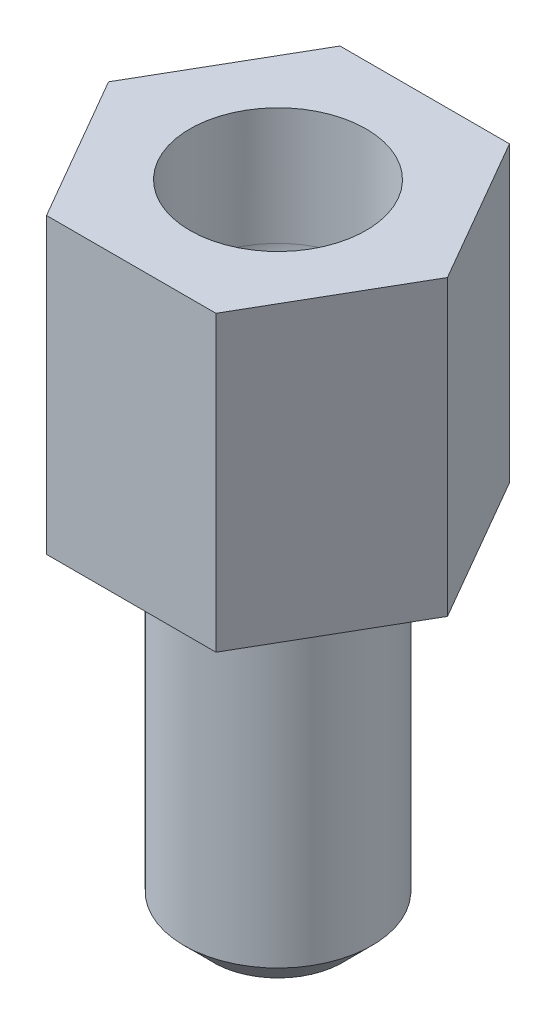
ISO-10303-21;
HEADER;
FILE_DESCRIPTION(('STEP AP214'),'2;1');
FILE_NAME('part.step','',(''),(''),'','','');
FILE_SCHEMA(('AUTOMOTIVE_DESIGN { 1 0 10303 214 1 1 1 1 }'));
ENDSEC;
DATA;
#1=APPLICATION_CONTEXT('core data for automotive mechanical design processes');
#2=APPLICATION_PROTOCOL_DEFINITION('international standard','automotive_design',2000,#1);
#3=PRODUCT_CONTEXT('',#1,'mechanical');
#4=PRODUCT('Part','Part','',(#3));
#5=PRODUCT_RELATED_PRODUCT_CATEGORY('part','',(#4));
#6=PRODUCT_DEFINITION_FORMATION('','',#4);
#7=PRODUCT_DEFINITION_CONTEXT('part definition',#1,'design');
#8=PRODUCT_DEFINITION('design','',#6,#7);
#9=PRODUCT_DEFINITION_SHAPE('','',#8);
#10=(LENGTH_UNIT() NAMED_UNIT(*) SI_UNIT(.MILLI.,.METRE.));
#11=(NAMED_UNIT(*) PLANE_ANGLE_UNIT() SI_UNIT($,.RADIAN.));
#12=(NAMED_UNIT(*) SI_UNIT($,.STERADIAN.) SOLID_ANGLE_UNIT());
#13=UNCERTAINTY_MEASURE_WITH_UNIT(LENGTH_MEASURE(1.E-05),#10,'distance_accuracy_value','');
#14=(GEOMETRIC_REPRESENTATION_CONTEXT(3) GLOBAL_UNCERTAINTY_ASSIGNED_CONTEXT((#13)) GLOBAL_UNIT_ASSIGNED_CONTEXT((#10,
#11,#12)) REPRESENTATION_CONTEXT('',''));
#15=CARTESIAN_POINT('',(0.,0.,0.));
#16=DIRECTION('',(0.,0.,1.));
#17=DIRECTION('',(1.,0.,0.));
#18=AXIS2_PLACEMENT_3D('',#15,#16,#17);
#19=CARTESIAN_POINT('',(0.,5.,0.));
#20=DIRECTION('',(0.,-1.,0.));
#21=DIRECTION('',(0.,0.,-1.));
#22=AXIS2_PLACEMENT_3D('',#19,#20,#21);
#23=CYLINDRICAL_SURFACE('',#22,1.5);
#24=CARTESIAN_POINT('',(0.,3.,0.));
#25=DIRECTION('',(0.,-1.,0.));
#26=DIRECTION('',(0.,0.,-1.));
#27=AXIS2_PLACEMENT_3D('',#24,#25,#26);
#28=CIRCLE('',#27,1.5);
#29=CARTESIAN_POINT('',(0.,3.,-1.5));
#30=VERTEX_POINT('',#29);
#31=EDGE_CURVE('E43',#30,#30,#28,.T.);
#32=ORIENTED_EDGE('',*,*,#31,.T.);
#33=EDGE_LOOP('',(#32));
#34=FACE_BOUND('',#33,.T.);
#35=CARTESIAN_POINT('',(0.,5.,0.));
#36=DIRECTION('',(0.,1.,0.));
#37=DIRECTION('',(0.,0.,1.));
#38=AXIS2_PLACEMENT_3D('',#35,#36,#37);
#39=CIRCLE('',#38,1.5);
#40=CARTESIAN_POINT('',(0.,5.,1.5));
#41=VERTEX_POINT('',#40);
#42=EDGE_CURVE('E125',#41,#41,#39,.T.);
#43=ORIENTED_EDGE('',*,*,#42,.T.);
#44=EDGE_LOOP('',(#43));
#45=FACE_BOUND('',#44,.T.);
#46=ADVANCED_FACE('F34',(#34,#45),#23,.F.);
#47=CARTESIAN_POINT('',(0.,5.,-5.));
#48=DIRECTION('',(0.,1.,0.));
#49=DIRECTION('',(0.,0.,1.));
#50=AXIS2_PLACEMENT_3D('',#47,#48,#49);
#51=PLANE('',#50);
#52=DIRECTION('',(-0.5,0.,-0.866025403784439));
#53=VECTOR('',#52,1.);
#54=CARTESIAN_POINT('',(1.44337567297406,5.,-2.5));
#55=LINE('',#54,#53);
#56=CARTESIAN_POINT('',(2.88675134594813,5.,0.));
#57=VERTEX_POINT('',#56);
#58=CARTESIAN_POINT('',(1.44337567297406,5.,-2.5));
#59=VERTEX_POINT('',#58);
#60=EDGE_CURVE('E132',#57,#59,#55,.T.);
#61=ORIENTED_EDGE('',*,*,#60,.T.);
#62=DIRECTION('',(-1.,0.,0.));
#63=VECTOR('',#62,1.);
#64=CARTESIAN_POINT('',(-1.44337567297406,5.,-2.5));
#65=LINE('',#64,#63);
#66=CARTESIAN_POINT('',(-1.44337567297406,5.,-2.5));
#67=VERTEX_POINT('',#66);
#68=EDGE_CURVE('E89',#59,#67,#65,.T.);
#69=ORIENTED_EDGE('',*,*,#68,.T.);
#70=DIRECTION('',(-0.5,0.,0.866025403784438));
#71=VECTOR('',#70,1.);
#72=CARTESIAN_POINT('',(-2.88675134594813,5.,0.));
#73=LINE('',#72,#71);
#74=CARTESIAN_POINT('',(-2.88675134594813,5.,0.));
#75=VERTEX_POINT('',#74);
#76=EDGE_CURVE('E103',#67,#75,#73,.T.);
#77=ORIENTED_EDGE('',*,*,#76,.T.);
#78=DIRECTION('',(0.5,0.,0.866025403784438));
#79=VECTOR('',#78,1.);
#80=CARTESIAN_POINT('',(-1.44337567297406,5.,2.5));
#81=LINE('',#80,#79);
#82=CARTESIAN_POINT('',(-1.44337567297406,5.,2.5));
#83=VERTEX_POINT('',#82);
#84=EDGE_CURVE('E96',#75,#83,#81,.T.);
#85=ORIENTED_EDGE('',*,*,#84,.T.);
#86=DIRECTION('',(1.,0.,0.));
#87=VECTOR('',#86,1.);
#88=CARTESIAN_POINT('',(1.44337567297406,5.,2.5));
#89=LINE('',#88,#87);
#90=CARTESIAN_POINT('',(1.44337567297406,5.,2.5));
#91=VERTEX_POINT('',#90);
#92=EDGE_CURVE('E101',#83,#91,#89,.T.);
#93=ORIENTED_EDGE('',*,*,#92,.T.);
#94=DIRECTION('',(0.5,0.,-0.866025403784439));
#95=VECTOR('',#94,1.);
#96=CARTESIAN_POINT('',(2.88675134594813,5.,0.));
#97=LINE('',#96,#95);
#98=EDGE_CURVE('E51',#91,#57,#97,.T.);
#99=ORIENTED_EDGE('',*,*,#98,.T.);
#100=EDGE_LOOP('',(#61,#69,#77,#85,#93,#99));
#101=FACE_BOUND('',#100,.T.);
#102=ORIENTED_EDGE('',*,*,#42,.F.);
#103=EDGE_LOOP('',(#102));
#104=FACE_BOUND('',#103,.T.);
#105=ADVANCED_FACE('F98',(#101,#104),#51,.T.);
#106=CARTESIAN_POINT('',(0.,0.,-5.));
#107=DIRECTION('',(0.,1.,0.));
#108=DIRECTION('',(0.,0.,1.));
#109=AXIS2_PLACEMENT_3D('',#106,#107,#108);
#110=PLANE('',#109);
#111=CARTESIAN_POINT('',(0.,0.,0.));
#112=DIRECTION('',(0.,1.,0.));
#113=DIRECTION('',(0.,0.,1.));
#114=AXIS2_PLACEMENT_3D('',#111,#112,#113);
#115=CIRCLE('',#114,2.1);
#116=CARTESIAN_POINT('',(0.,0.,2.1));
#117=VERTEX_POINT('',#116);
#118=EDGE_CURVE('E147',#117,#117,#115,.T.);
#119=ORIENTED_EDGE('',*,*,#118,.T.);
#120=EDGE_LOOP('',(#119));
#121=FACE_BOUND('',#120,.T.);
#122=DIRECTION('',(-0.5,0.,-0.866025403784439));
#123=VECTOR('',#122,1.);
#124=CARTESIAN_POINT('',(1.44337567297406,0.,-2.5));
#125=LINE('',#124,#123);
#126=CARTESIAN_POINT('',(2.88675134594813,0.,0.));
#127=VERTEX_POINT('',#126);
#128=CARTESIAN_POINT('',(1.44337567297406,0.,-2.5));
#129=VERTEX_POINT('',#128);
#130=EDGE_CURVE('E121',#127,#129,#125,.T.);
#131=ORIENTED_EDGE('',*,*,#130,.F.);
#132=DIRECTION('',(0.5,0.,-0.866025403784439));
#133=VECTOR('',#132,1.);
#134=CARTESIAN_POINT('',(2.88675134594813,0.,0.));
#135=LINE('',#134,#133);
#136=CARTESIAN_POINT('',(1.44337567297406,0.,2.5));
#137=VERTEX_POINT('',#136);
#138=EDGE_CURVE('E80',#137,#127,#135,.T.);
#139=ORIENTED_EDGE('',*,*,#138,.F.);
#140=DIRECTION('',(1.,0.,0.));
#141=VECTOR('',#140,1.);
#142=CARTESIAN_POINT('',(1.44337567297406,0.,2.5));
#143=LINE('',#142,#141);
#144=CARTESIAN_POINT('',(-1.44337567297406,0.,2.5));
#145=VERTEX_POINT('',#144);
#146=EDGE_CURVE('E74',#145,#137,#143,.T.);
#147=ORIENTED_EDGE('',*,*,#146,.F.);
#148=DIRECTION('',(0.5,0.,0.866025403784438));
#149=VECTOR('',#148,1.);
#150=CARTESIAN_POINT('',(-1.44337567297406,0.,2.5));
#151=LINE('',#150,#149);
#152=CARTESIAN_POINT('',(-2.88675134594813,0.,0.));
#153=VERTEX_POINT('',#152);
#154=EDGE_CURVE('E111',#153,#145,#151,.T.);
#155=ORIENTED_EDGE('',*,*,#154,.F.);
#156=DIRECTION('',(-0.5,0.,0.866025403784438));
#157=VECTOR('',#156,1.);
#158=CARTESIAN_POINT('',(-2.88675134594813,0.,0.));
#159=LINE('',#158,#157);
#160=CARTESIAN_POINT('',(-1.44337567297406,0.,-2.5));
#161=VERTEX_POINT('',#160);
#162=EDGE_CURVE('E127',#161,#153,#159,.T.);
#163=ORIENTED_EDGE('',*,*,#162,.F.);
#164=DIRECTION('',(-1.,0.,0.));
#165=VECTOR('',#164,1.);
#166=CARTESIAN_POINT('',(-1.44337567297406,0.,-2.5));
#167=LINE('',#166,#165);
#168=EDGE_CURVE('E124',#129,#161,#167,.T.);
#169=ORIENTED_EDGE('',*,*,#168,.F.);
#170=EDGE_LOOP('',(#131,#139,#147,#155,#163,#169));
#171=FACE_BOUND('',#170,.T.);
#172=ADVANCED_FACE('F171',(#121,#171),#110,.F.);
#173=CARTESIAN_POINT('',(1.44337567297406,5.,-2.5));
#174=DIRECTION('',(-0.866025403784439,0.,0.5));
#175=DIRECTION('',(0.5,0.,0.866025403784439));
#176=AXIS2_PLACEMENT_3D('',#173,#174,#175);
#177=PLANE('',#176);
#178=ORIENTED_EDGE('',*,*,#130,.T.);
#179=DIRECTION('',(0.,-1.,0.));
#180=VECTOR('',#179,1.);
#181=CARTESIAN_POINT('',(1.44337567297406,5.,-2.5));
#182=LINE('',#181,#180);
#183=EDGE_CURVE('E139',#59,#129,#182,.T.);
#184=ORIENTED_EDGE('',*,*,#183,.F.);
#185=ORIENTED_EDGE('',*,*,#60,.F.);
#186=DIRECTION('',(0.,-1.,0.));
#187=VECTOR('',#186,1.);
#188=CARTESIAN_POINT('',(2.88675134594813,5.,0.));
#189=LINE('',#188,#187);
#190=EDGE_CURVE('E117',#57,#127,#189,.T.);
#191=ORIENTED_EDGE('',*,*,#190,.T.);
#192=EDGE_LOOP('',(#178,#184,#185,#191));
#193=FACE_BOUND('',#192,.T.);
#194=ADVANCED_FACE('F179',(#193),#177,.F.);
#195=CARTESIAN_POINT('',(-1.44337567297406,5.,-2.5));
#196=DIRECTION('',(0.,0.,1.));
#197=DIRECTION('',(1.,0.,0.));
#198=AXIS2_PLACEMENT_3D('',#195,#196,#197);
#199=PLANE('',#198);
#200=ORIENTED_EDGE('',*,*,#168,.T.);
#201=DIRECTION('',(0.,-1.,0.));
#202=VECTOR('',#201,1.);
#203=CARTESIAN_POINT('',(-1.44337567297406,5.,-2.5));
#204=LINE('',#203,#202);
#205=EDGE_CURVE('E136',#67,#161,#204,.T.);
#206=ORIENTED_EDGE('',*,*,#205,.F.);
#207=ORIENTED_EDGE('',*,*,#68,.F.);
#208=ORIENTED_EDGE('',*,*,#183,.T.);
#209=EDGE_LOOP('',(#200,#206,#207,#208));
#210=FACE_BOUND('',#209,.T.);
#211=ADVANCED_FACE('F192',(#210),#199,.F.);
#212=CARTESIAN_POINT('',(-2.88675134594813,5.,0.));
#213=DIRECTION('',(0.866025403784439,0.,0.5));
#214=DIRECTION('',(0.5,0.,-0.866025403784439));
#215=AXIS2_PLACEMENT_3D('',#212,#213,#214);
#216=PLANE('',#215);
#217=ORIENTED_EDGE('',*,*,#162,.T.);
#218=DIRECTION('',(0.,-1.,0.));
#219=VECTOR('',#218,1.);
#220=CARTESIAN_POINT('',(-2.88675134594813,5.,0.));
#221=LINE('',#220,#219);
#222=EDGE_CURVE('E112',#75,#153,#221,.T.);
#223=ORIENTED_EDGE('',*,*,#222,.F.);
#224=ORIENTED_EDGE('',*,*,#76,.F.);
#225=ORIENTED_EDGE('',*,*,#205,.T.);
#226=EDGE_LOOP('',(#217,#223,#224,#225));
#227=FACE_BOUND('',#226,.T.);
#228=ADVANCED_FACE('F189',(#227),#216,.F.);
#229=CARTESIAN_POINT('',(-1.44337567297406,5.,2.5));
#230=DIRECTION('',(0.866025403784438,0.,-0.5));
#231=DIRECTION('',(-0.5,0.,-0.866025403784438));
#232=AXIS2_PLACEMENT_3D('',#229,#230,#231);
#233=PLANE('',#232);
#234=ORIENTED_EDGE('',*,*,#154,.T.);
#235=DIRECTION('',(0.,-1.,0.));
#236=VECTOR('',#235,1.);
#237=CARTESIAN_POINT('',(-1.44337567297406,5.,2.5));
#238=LINE('',#237,#236);
#239=EDGE_CURVE('E108',#83,#145,#238,.T.);
#240=ORIENTED_EDGE('',*,*,#239,.F.);
#241=ORIENTED_EDGE('',*,*,#84,.F.);
#242=ORIENTED_EDGE('',*,*,#222,.T.);
#243=EDGE_LOOP('',(#234,#240,#241,#242));
#244=FACE_BOUND('',#243,.T.);
#245=ADVANCED_FACE('F109',(#244),#233,.F.);
#246=CARTESIAN_POINT('',(1.44337567297406,5.,2.5));
#247=DIRECTION('',(0.,0.,-1.));
#248=DIRECTION('',(-1.,0.,0.));
#249=AXIS2_PLACEMENT_3D('',#246,#247,#248);
#250=PLANE('',#249);
#251=ORIENTED_EDGE('',*,*,#146,.T.);
#252=DIRECTION('',(0.,-1.,0.));
#253=VECTOR('',#252,1.);
#254=CARTESIAN_POINT('',(1.44337567297406,5.,2.5));
#255=LINE('',#254,#253);
#256=EDGE_CURVE('E113',#91,#137,#255,.T.);
#257=ORIENTED_EDGE('',*,*,#256,.F.);
#258=ORIENTED_EDGE('',*,*,#92,.F.);
#259=ORIENTED_EDGE('',*,*,#239,.T.);
#260=EDGE_LOOP('',(#251,#257,#258,#259));
#261=FACE_BOUND('',#260,.T.);
#262=ADVANCED_FACE('F115',(#261),#250,.F.);
#263=CARTESIAN_POINT('',(2.88675134594813,5.,0.));
#264=DIRECTION('',(-0.866025403784439,0.,-0.5));
#265=DIRECTION('',(-0.5,0.,0.866025403784439));
#266=AXIS2_PLACEMENT_3D('',#263,#264,#265);
#267=PLANE('',#266);
#268=ORIENTED_EDGE('',*,*,#138,.T.);
#269=ORIENTED_EDGE('',*,*,#190,.F.);
#270=ORIENTED_EDGE('',*,*,#98,.F.);
#271=ORIENTED_EDGE('',*,*,#256,.T.);
#272=EDGE_LOOP('',(#268,#269,#270,#271));
#273=FACE_BOUND('',#272,.T.);
#274=ADVANCED_FACE('F181',(#273),#267,.F.);
#275=CARTESIAN_POINT('',(0.,2.,0.));
#276=DIRECTION('',(0.,-1.,0.));
#277=DIRECTION('',(0.,0.,-1.));
#278=AXIS2_PLACEMENT_3D('',#275,#276,#277);
#279=PLANE('',#278);
#280=CARTESIAN_POINT('',(0.,2.,0.));
#281=DIRECTION('',(0.,-1.,0.));
#282=DIRECTION('',(0.,0.,-1.));
#283=AXIS2_PLACEMENT_3D('',#280,#281,#282);
#284=CIRCLE('',#283,0.5);
#285=CARTESIAN_POINT('',(0.,2.,-0.5));
#286=VERTEX_POINT('',#285);
#287=EDGE_CURVE('E11',#286,#286,#284,.F.);
#288=ORIENTED_EDGE('',*,*,#287,.T.);
#289=EDGE_LOOP('',(#288));
#290=FACE_BOUND('',#289,.T.);
#291=ADVANCED_FACE('F184',(#290),#279,.F.);
#292=CARTESIAN_POINT('',(0.,2.,0.));
#293=DIRECTION('',(0.,-1.,0.));
#294=DIRECTION('',(0.,0.,-1.));
#295=AXIS2_PLACEMENT_3D('',#292,#293,#294);
#296=CYLINDRICAL_SURFACE('',#295,1.6);
#297=CARTESIAN_POINT('',(0.,-0.5,0.));
#298=DIRECTION('',(0.,1.,0.));
#299=DIRECTION('',(0.,0.,1.));
#300=AXIS2_PLACEMENT_3D('',#297,#298,#299);
#301=CIRCLE('',#300,1.6);
#302=CARTESIAN_POINT('',(0.,-0.5,1.6));
#303=VERTEX_POINT('',#302);
#304=EDGE_CURVE('E150',#303,#303,#301,.F.);
#305=ORIENTED_EDGE('',*,*,#304,.T.);
#306=EDGE_LOOP('',(#305));
#307=FACE_BOUND('',#306,.T.);
#308=CARTESIAN_POINT('',(0.,-5.5,0.));
#309=DIRECTION('',(0.,-1.,0.));
#310=DIRECTION('',(0.,0.,-1.));
#311=AXIS2_PLACEMENT_3D('',#308,#309,#310);
#312=CIRCLE('',#311,1.6);
#313=CARTESIAN_POINT('',(0.,-5.5,-1.6));
#314=VERTEX_POINT('',#313);
#315=EDGE_CURVE('E144',#314,#314,#312,.F.);
#316=ORIENTED_EDGE('',*,*,#315,.T.);
#317=EDGE_LOOP('',(#316));
#318=FACE_BOUND('',#317,.T.);
#319=ADVANCED_FACE('F174',(#307,#318),#296,.T.);
#320=CARTESIAN_POINT('',(0.,-6.,0.));
#321=DIRECTION('',(0.,-1.,0.));
#322=DIRECTION('',(0.,0.,-1.));
#323=AXIS2_PLACEMENT_3D('',#320,#321,#322);
#324=PLANE('',#323);
#325=CARTESIAN_POINT('',(0.,-6.,0.));
#326=DIRECTION('',(0.,-1.,0.));
#327=DIRECTION('',(0.,0.,-1.));
#328=AXIS2_PLACEMENT_3D('',#325,#326,#327);
#329=CIRCLE('',#328,1.1);
#330=CARTESIAN_POINT('',(0.,-6.,-1.1));
#331=VERTEX_POINT('',#330);
#332=EDGE_CURVE('E141',#331,#331,#329,.T.);
#333=ORIENTED_EDGE('',*,*,#332,.T.);
#334=EDGE_LOOP('',(#333));
#335=FACE_BOUND('',#334,.T.);
#336=ADVANCED_FACE('F200',(#335),#324,.T.);
#337=CARTESIAN_POINT('',(0.,-6.,0.));
#338=DIRECTION('',(0.,1.,0.));
#339=DIRECTION('',(0.,0.,1.));
#340=AXIS2_PLACEMENT_3D('',#337,#338,#339);
#341=CONICAL_SURFACE('',#340,1.1,0.785398163397446);
#342=ORIENTED_EDGE('',*,*,#315,.F.);
#343=EDGE_LOOP('',(#342));
#344=FACE_BOUND('',#343,.T.);
#345=ORIENTED_EDGE('',*,*,#332,.F.);
#346=EDGE_LOOP('',(#345));
#347=FACE_BOUND('',#346,.T.);
#348=ADVANCED_FACE('F163',(#344,#347),#341,.T.);
#349=CARTESIAN_POINT('',(0.,-0.5,0.));
#350=DIRECTION('',(0.,1.,0.));
#351=DIRECTION('',(0.,0.,1.));
#352=AXIS2_PLACEMENT_3D('',#349,#350,#351);
#353=TOROIDAL_SURFACE('',#352,2.1,0.5);
#354=ORIENTED_EDGE('',*,*,#304,.F.);
#355=EDGE_LOOP('',(#354));
#356=FACE_BOUND('',#355,.T.);
#357=ORIENTED_EDGE('',*,*,#118,.F.);
#358=EDGE_LOOP('',(#357));
#359=FACE_BOUND('',#358,.T.);
#360=ADVANCED_FACE('F158',(#356,#359),#353,.F.);
#361=CARTESIAN_POINT('',(0.,3.,0.));
#362=DIRECTION('',(0.,-1.,0.));
#363=DIRECTION('',(0.,0.,-1.));
#364=AXIS2_PLACEMENT_3D('',#361,#362,#363);
#365=DEGENERATE_TOROIDAL_SURFACE('',#364,0.5,1.,.T.);
#366=ORIENTED_EDGE('',*,*,#287,.F.);
#367=EDGE_LOOP('',(#366));
#368=FACE_BOUND('',#367,.T.);
#369=ORIENTED_EDGE('',*,*,#31,.F.);
#370=EDGE_LOOP('',(#369));
#371=FACE_BOUND('',#370,.T.);
#372=ADVANCED_FACE('F36',(#368,#371),#365,.F.);
#373=CLOSED_SHELL('',(#46,#105,#172,#194,#211,#228,#245,#262,#274,#291,#319,#336,#348,#360,#372));
#374=MANIFOLD_SOLID_BREP('B2',#373);
#375=ADVANCED_BREP_SHAPE_REPRESENTATION('',(#18,#374),#14);
#376=SHAPE_DEFINITION_REPRESENTATION(#9,#375);
ENDSEC;
END-ISO-10303-21;
